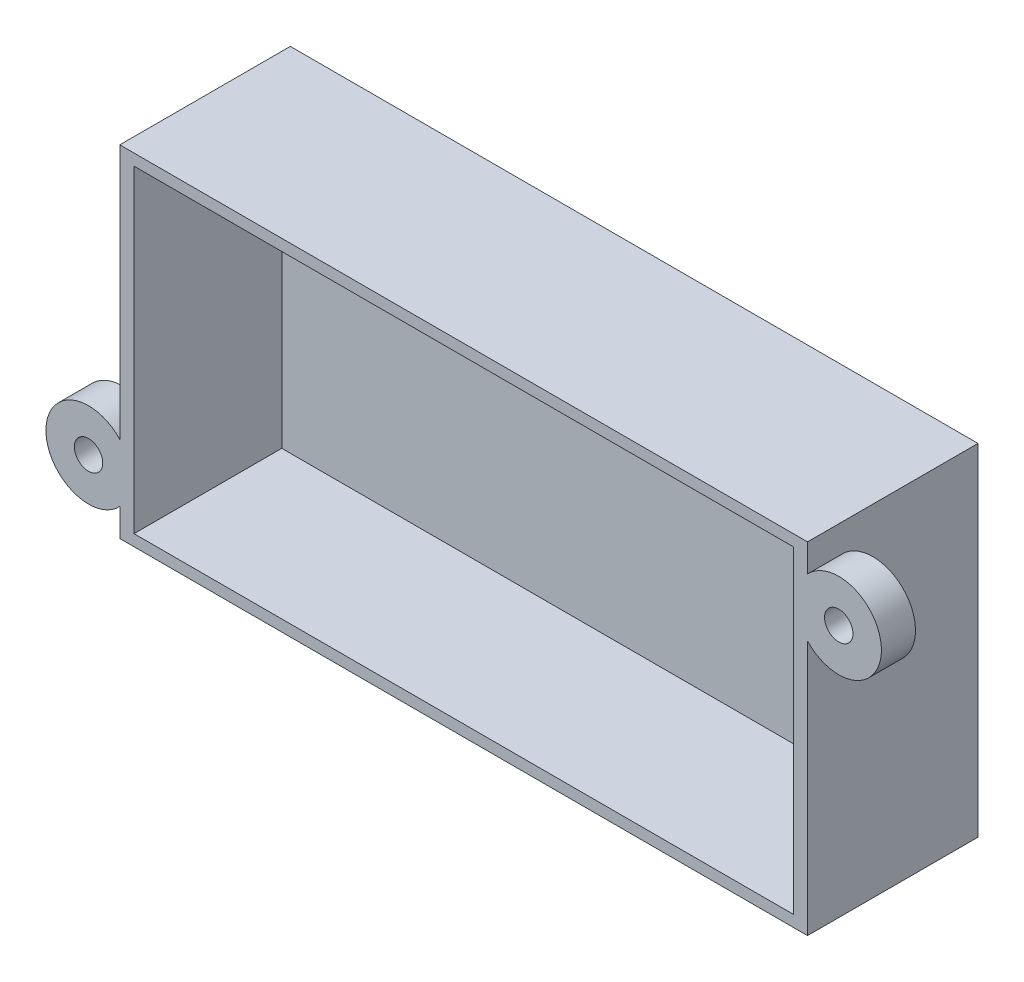
ISO-10303-21;
HEADER;
FILE_DESCRIPTION(('STEP AP214'),'2;1');
FILE_NAME('part.step','',(''),(''),'','','');
FILE_SCHEMA(('AUTOMOTIVE_DESIGN { 1 0 10303 214 1 1 1 1 }'));
ENDSEC;
DATA;
#1=APPLICATION_CONTEXT('core data for automotive mechanical design processes');
#2=APPLICATION_PROTOCOL_DEFINITION('international standard','automotive_design',2000,#1);
#3=PRODUCT_CONTEXT('',#1,'mechanical');
#4=PRODUCT('Part','Part','',(#3));
#5=PRODUCT_RELATED_PRODUCT_CATEGORY('part','',(#4));
#6=PRODUCT_DEFINITION_FORMATION('','',#4);
#7=PRODUCT_DEFINITION_CONTEXT('part definition',#1,'design');
#8=PRODUCT_DEFINITION('design','',#6,#7);
#9=PRODUCT_DEFINITION_SHAPE('','',#8);
#10=(LENGTH_UNIT() NAMED_UNIT(*) SI_UNIT(.MILLI.,.METRE.));
#11=(NAMED_UNIT(*) PLANE_ANGLE_UNIT() SI_UNIT($,.RADIAN.));
#12=(NAMED_UNIT(*) SI_UNIT($,.STERADIAN.) SOLID_ANGLE_UNIT());
#13=UNCERTAINTY_MEASURE_WITH_UNIT(LENGTH_MEASURE(1.E-05),#10,'distance_accuracy_value','');
#14=(GEOMETRIC_REPRESENTATION_CONTEXT(3) GLOBAL_UNCERTAINTY_ASSIGNED_CONTEXT((#13)) GLOBAL_UNIT_ASSIGNED_CONTEXT((#10,
#11,#12)) REPRESENTATION_CONTEXT('',''));
#15=CARTESIAN_POINT('',(0.,0.,0.));
#16=DIRECTION('',(0.,0.,1.));
#17=DIRECTION('',(1.,0.,0.));
#18=AXIS2_PLACEMENT_3D('',#15,#16,#17);
#19=CARTESIAN_POINT('',(30.25,15.,15.));
#20=DIRECTION('',(-1.,0.,0.));
#21=DIRECTION('',(0.,-1.,0.));
#22=AXIS2_PLACEMENT_3D('',#19,#20,#21);
#23=PLANE('',#22);
#24=DIRECTION('',(0.,0.,1.));
#25=VECTOR('',#24,1.);
#26=CARTESIAN_POINT('',(30.25,7.45049024320359,12.));
#27=LINE('',#26,#25);
#28=CARTESIAN_POINT('',(30.25,7.45049024320359,12.));
#29=VERTEX_POINT('',#28);
#30=CARTESIAN_POINT('',(30.25,7.45049024320359,15.));
#31=VERTEX_POINT('',#30);
#32=EDGE_CURVE('E162',#29,#31,#27,.T.);
#33=ORIENTED_EDGE('',*,*,#32,.T.);
#34=DIRECTION('',(0.,1.,0.));
#35=VECTOR('',#34,1.);
#36=CARTESIAN_POINT('',(30.25,15.,15.));
#37=LINE('',#36,#35);
#38=CARTESIAN_POINT('',(30.25,-15.,15.));
#39=VERTEX_POINT('',#38);
#40=EDGE_CURVE('E234',#39,#31,#37,.T.);
#41=ORIENTED_EDGE('',*,*,#40,.F.);
#42=DIRECTION('',(0.,0.,-1.));
#43=VECTOR('',#42,1.);
#44=CARTESIAN_POINT('',(30.25,-15.,15.));
#45=LINE('',#44,#43);
#46=CARTESIAN_POINT('',(30.25,-15.,0.));
#47=VERTEX_POINT('',#46);
#48=EDGE_CURVE('E248',#39,#47,#45,.T.);
#49=ORIENTED_EDGE('',*,*,#48,.T.);
#50=DIRECTION('',(0.,1.,0.));
#51=VECTOR('',#50,1.);
#52=CARTESIAN_POINT('',(30.25,15.,0.));
#53=LINE('',#52,#51);
#54=CARTESIAN_POINT('',(30.25,15.,0.));
#55=VERTEX_POINT('',#54);
#56=EDGE_CURVE('E224',#47,#55,#53,.T.);
#57=ORIENTED_EDGE('',*,*,#56,.T.);
#58=DIRECTION('',(0.,0.,-1.));
#59=VECTOR('',#58,1.);
#60=CARTESIAN_POINT('',(30.25,15.,15.));
#61=LINE('',#60,#59);
#62=CARTESIAN_POINT('',(30.25,15.,15.));
#63=VERTEX_POINT('',#62);
#64=EDGE_CURVE('E11',#63,#55,#61,.T.);
#65=ORIENTED_EDGE('',*,*,#64,.F.);
#66=CARTESIAN_POINT('',(30.25,12.5495097567964,15.));
#67=VERTEX_POINT('',#66);
#68=EDGE_CURVE('E238',#67,#63,#37,.T.);
#69=ORIENTED_EDGE('',*,*,#68,.F.);
#70=DIRECTION('',(0.,0.,1.));
#71=VECTOR('',#70,1.);
#72=CARTESIAN_POINT('',(30.25,12.5495097567964,12.));
#73=LINE('',#72,#71);
#74=CARTESIAN_POINT('',(30.25,12.5495097567964,12.));
#75=VERTEX_POINT('',#74);
#76=EDGE_CURVE('E179',#75,#67,#73,.T.);
#77=ORIENTED_EDGE('',*,*,#76,.F.);
#78=DIRECTION('',(0.,1.,0.));
#79=VECTOR('',#78,1.);
#80=CARTESIAN_POINT('',(30.25,0.,12.));
#81=LINE('',#80,#79);
#82=EDGE_CURVE('E171',#29,#75,#81,.T.);
#83=ORIENTED_EDGE('',*,*,#82,.F.);
#84=EDGE_LOOP('',(#33,#41,#49,#57,#65,#69,#77,#83));
#85=FACE_BOUND('',#84,.T.);
#86=ADVANCED_FACE('F45',(#85),#23,.F.);
#87=CARTESIAN_POINT('',(-30.25,15.,15.));
#88=DIRECTION('',(0.,-1.,0.));
#89=DIRECTION('',(0.,0.,-1.));
#90=AXIS2_PLACEMENT_3D('',#87,#88,#89);
#91=PLANE('',#90);
#92=DIRECTION('',(-1.,0.,0.));
#93=VECTOR('',#92,1.);
#94=CARTESIAN_POINT('',(-30.25,15.,0.));
#95=LINE('',#94,#93);
#96=CARTESIAN_POINT('',(-30.25,15.,0.));
#97=VERTEX_POINT('',#96);
#98=EDGE_CURVE('E252',#55,#97,#95,.T.);
#99=ORIENTED_EDGE('',*,*,#98,.T.);
#100=DIRECTION('',(0.,0.,-1.));
#101=VECTOR('',#100,1.);
#102=CARTESIAN_POINT('',(-30.25,15.,15.));
#103=LINE('',#102,#101);
#104=CARTESIAN_POINT('',(-30.25,15.,15.));
#105=VERTEX_POINT('',#104);
#106=EDGE_CURVE('E53',#105,#97,#103,.T.);
#107=ORIENTED_EDGE('',*,*,#106,.F.);
#108=DIRECTION('',(-1.,0.,0.));
#109=VECTOR('',#108,1.);
#110=CARTESIAN_POINT('',(-30.25,15.,15.));
#111=LINE('',#110,#109);
#112=EDGE_CURVE('E237',#63,#105,#111,.T.);
#113=ORIENTED_EDGE('',*,*,#112,.F.);
#114=ORIENTED_EDGE('',*,*,#64,.T.);
#115=EDGE_LOOP('',(#99,#107,#113,#114));
#116=FACE_BOUND('',#115,.T.);
#117=ADVANCED_FACE('F293',(#116),#91,.F.);
#118=CARTESIAN_POINT('',(-30.25,15.,15.));
#119=DIRECTION('',(1.,0.,0.));
#120=DIRECTION('',(0.,1.,0.));
#121=AXIS2_PLACEMENT_3D('',#118,#119,#120);
#122=PLANE('',#121);
#123=DIRECTION('',(0.,-1.,0.));
#124=VECTOR('',#123,1.);
#125=CARTESIAN_POINT('',(-30.25,0.,12.));
#126=LINE('',#125,#124);
#127=CARTESIAN_POINT('',(-30.25,-7.4504902432036,12.));
#128=VERTEX_POINT('',#127);
#129=CARTESIAN_POINT('',(-30.25,-12.5495097567964,12.));
#130=VERTEX_POINT('',#129);
#131=EDGE_CURVE('E146',#128,#130,#126,.T.);
#132=ORIENTED_EDGE('',*,*,#131,.F.);
#133=DIRECTION('',(0.,0.,1.));
#134=VECTOR('',#133,1.);
#135=CARTESIAN_POINT('',(-30.25,-7.4504902432036,12.));
#136=LINE('',#135,#134);
#137=CARTESIAN_POINT('',(-30.25,-7.4504902432036,15.));
#138=VERTEX_POINT('',#137);
#139=EDGE_CURVE('E133',#128,#138,#136,.T.);
#140=ORIENTED_EDGE('',*,*,#139,.T.);
#141=DIRECTION('',(0.,-1.,0.));
#142=VECTOR('',#141,1.);
#143=CARTESIAN_POINT('',(-30.25,15.,15.));
#144=LINE('',#143,#142);
#145=EDGE_CURVE('E242',#105,#138,#144,.T.);
#146=ORIENTED_EDGE('',*,*,#145,.F.);
#147=ORIENTED_EDGE('',*,*,#106,.T.);
#148=DIRECTION('',(0.,-1.,0.));
#149=VECTOR('',#148,1.);
#150=CARTESIAN_POINT('',(-30.25,15.,0.));
#151=LINE('',#150,#149);
#152=CARTESIAN_POINT('',(-30.25,-15.,0.));
#153=VERTEX_POINT('',#152);
#154=EDGE_CURVE('E255',#97,#153,#151,.T.);
#155=ORIENTED_EDGE('',*,*,#154,.T.);
#156=DIRECTION('',(0.,0.,-1.));
#157=VECTOR('',#156,1.);
#158=CARTESIAN_POINT('',(-30.25,-15.,15.));
#159=LINE('',#158,#157);
#160=CARTESIAN_POINT('',(-30.25,-15.,15.));
#161=VERTEX_POINT('',#160);
#162=EDGE_CURVE('E264',#161,#153,#159,.T.);
#163=ORIENTED_EDGE('',*,*,#162,.F.);
#164=CARTESIAN_POINT('',(-30.25,-12.5495097567964,15.));
#165=VERTEX_POINT('',#164);
#166=EDGE_CURVE('E241',#165,#161,#144,.T.);
#167=ORIENTED_EDGE('',*,*,#166,.F.);
#168=DIRECTION('',(0.,0.,1.));
#169=VECTOR('',#168,1.);
#170=CARTESIAN_POINT('',(-30.25,-12.5495097567964,12.));
#171=LINE('',#170,#169);
#172=EDGE_CURVE('E142',#130,#165,#171,.T.);
#173=ORIENTED_EDGE('',*,*,#172,.F.);
#174=EDGE_LOOP('',(#132,#140,#146,#147,#155,#163,#167,#173));
#175=FACE_BOUND('',#174,.T.);
#176=ADVANCED_FACE('F149',(#175),#122,.F.);
#177=CARTESIAN_POINT('',(-30.25,-15.,15.));
#178=DIRECTION('',(0.,1.,0.));
#179=DIRECTION('',(0.,0.,1.));
#180=AXIS2_PLACEMENT_3D('',#177,#178,#179);
#181=PLANE('',#180);
#182=DIRECTION('',(1.,0.,0.));
#183=VECTOR('',#182,1.);
#184=CARTESIAN_POINT('',(-30.25,-15.,0.));
#185=LINE('',#184,#183);
#186=EDGE_CURVE('E258',#153,#47,#185,.T.);
#187=ORIENTED_EDGE('',*,*,#186,.T.);
#188=ORIENTED_EDGE('',*,*,#48,.F.);
#189=DIRECTION('',(1.,0.,0.));
#190=VECTOR('',#189,1.);
#191=CARTESIAN_POINT('',(-30.25,-15.,15.));
#192=LINE('',#191,#190);
#193=EDGE_CURVE('E245',#161,#39,#192,.T.);
#194=ORIENTED_EDGE('',*,*,#193,.F.);
#195=ORIENTED_EDGE('',*,*,#162,.T.);
#196=EDGE_LOOP('',(#187,#188,#194,#195));
#197=FACE_BOUND('',#196,.T.);
#198=ADVANCED_FACE('F280',(#197),#181,.F.);
#199=CARTESIAN_POINT('',(0.,0.,15.));
#200=DIRECTION('',(0.,0.,1.));
#201=DIRECTION('',(1.,0.,0.));
#202=AXIS2_PLACEMENT_3D('',#199,#200,#201);
#203=PLANE('',#202);
#204=DIRECTION('',(0.,1.,0.));
#205=VECTOR('',#204,1.);
#206=CARTESIAN_POINT('',(29.,-14.,15.));
#207=LINE('',#206,#205);
#208=CARTESIAN_POINT('',(29.,-14.,15.));
#209=VERTEX_POINT('',#208);
#210=CARTESIAN_POINT('',(29.,14.,15.));
#211=VERTEX_POINT('',#210);
#212=EDGE_CURVE('E166',#209,#211,#207,.T.);
#213=ORIENTED_EDGE('',*,*,#212,.F.);
#214=DIRECTION('',(1.,0.,0.));
#215=VECTOR('',#214,1.);
#216=CARTESIAN_POINT('',(-29.,-14.,15.));
#217=LINE('',#216,#215);
#218=CARTESIAN_POINT('',(-29.,-14.,15.));
#219=VERTEX_POINT('',#218);
#220=EDGE_CURVE('E195',#219,#209,#217,.T.);
#221=ORIENTED_EDGE('',*,*,#220,.F.);
#222=DIRECTION('',(0.,-1.,0.));
#223=VECTOR('',#222,1.);
#224=CARTESIAN_POINT('',(-29.,-14.,15.));
#225=LINE('',#224,#223);
#226=CARTESIAN_POINT('',(-29.,14.,15.));
#227=VERTEX_POINT('',#226);
#228=EDGE_CURVE('E214',#227,#219,#225,.T.);
#229=ORIENTED_EDGE('',*,*,#228,.F.);
#230=DIRECTION('',(-1.,0.,0.));
#231=VECTOR('',#230,1.);
#232=CARTESIAN_POINT('',(-29.,14.,15.));
#233=LINE('',#232,#231);
#234=EDGE_CURVE('E210',#211,#227,#233,.T.);
#235=ORIENTED_EDGE('',*,*,#234,.F.);
#236=EDGE_LOOP('',(#213,#221,#229,#235));
#237=FACE_BOUND('',#236,.T.);
#238=ORIENTED_EDGE('',*,*,#40,.T.);
#239=CARTESIAN_POINT('',(33.,9.99999999999999,15.));
#240=DIRECTION('',(0.,0.,1.));
#241=DIRECTION('',(1.,0.,0.));
#242=AXIS2_PLACEMENT_3D('',#239,#240,#241);
#243=CIRCLE('',#242,3.74999999999998);
#244=EDGE_CURVE('E67',#67,#31,#243,.F.);
#245=ORIENTED_EDGE('',*,*,#244,.F.);
#246=ORIENTED_EDGE('',*,*,#68,.T.);
#247=ORIENTED_EDGE('',*,*,#112,.T.);
#248=ORIENTED_EDGE('',*,*,#145,.T.);
#249=CARTESIAN_POINT('',(-33.,-10.,15.));
#250=DIRECTION('',(0.,0.,1.));
#251=DIRECTION('',(1.,0.,0.));
#252=AXIS2_PLACEMENT_3D('',#249,#250,#251);
#253=CIRCLE('',#252,3.75);
#254=EDGE_CURVE('E60',#138,#165,#253,.T.);
#255=ORIENTED_EDGE('',*,*,#254,.T.);
#256=ORIENTED_EDGE('',*,*,#166,.T.);
#257=ORIENTED_EDGE('',*,*,#193,.T.);
#258=EDGE_LOOP('',(#238,#245,#246,#247,#248,#255,#256,#257));
#259=FACE_BOUND('',#258,.T.);
#260=CARTESIAN_POINT('',(33.,9.99999999999999,15.));
#261=DIRECTION('',(0.,0.,1.));
#262=DIRECTION('',(1.,0.,0.));
#263=AXIS2_PLACEMENT_3D('',#260,#261,#262);
#264=CIRCLE('',#263,1.25000000000001);
#265=CARTESIAN_POINT('',(34.25,9.99999999999999,15.));
#266=VERTEX_POINT('',#265);
#267=EDGE_CURVE('E172',#266,#266,#264,.F.);
#268=ORIENTED_EDGE('',*,*,#267,.T.);
#269=EDGE_LOOP('',(#268));
#270=FACE_BOUND('',#269,.T.);
#271=CARTESIAN_POINT('',(-33.,-10.,15.));
#272=DIRECTION('',(0.,0.,1.));
#273=DIRECTION('',(1.,0.,0.));
#274=AXIS2_PLACEMENT_3D('',#271,#272,#273);
#275=CIRCLE('',#274,1.25);
#276=CARTESIAN_POINT('',(-31.75,-10.,15.));
#277=VERTEX_POINT('',#276);
#278=EDGE_CURVE('E158',#277,#277,#275,.T.);
#279=ORIENTED_EDGE('',*,*,#278,.F.);
#280=EDGE_LOOP('',(#279));
#281=FACE_BOUND('',#280,.T.);
#282=ADVANCED_FACE('F287',(#237,#259,#270,#281),#203,.T.);
#283=CARTESIAN_POINT('',(0.,0.,0.));
#284=DIRECTION('',(0.,0.,1.));
#285=DIRECTION('',(1.,0.,0.));
#286=AXIS2_PLACEMENT_3D('',#283,#284,#285);
#287=PLANE('',#286);
#288=ORIENTED_EDGE('',*,*,#56,.F.);
#289=ORIENTED_EDGE('',*,*,#186,.F.);
#290=ORIENTED_EDGE('',*,*,#154,.F.);
#291=ORIENTED_EDGE('',*,*,#98,.F.);
#292=EDGE_LOOP('',(#288,#289,#290,#291));
#293=FACE_BOUND('',#292,.T.);
#294=ADVANCED_FACE('F277',(#293),#287,.F.);
#295=CARTESIAN_POINT('',(29.,-14.,2.));
#296=DIRECTION('',(1.,0.,0.));
#297=DIRECTION('',(0.,0.,-1.));
#298=AXIS2_PLACEMENT_3D('',#295,#296,#297);
#299=PLANE('',#298);
#300=ORIENTED_EDGE('',*,*,#212,.T.);
#301=DIRECTION('',(0.,0.,1.));
#302=VECTOR('',#301,1.);
#303=CARTESIAN_POINT('',(29.,14.,2.));
#304=LINE('',#303,#302);
#305=CARTESIAN_POINT('',(29.,14.,2.));
#306=VERTEX_POINT('',#305);
#307=EDGE_CURVE('E207',#306,#211,#304,.T.);
#308=ORIENTED_EDGE('',*,*,#307,.F.);
#309=DIRECTION('',(0.,1.,0.));
#310=VECTOR('',#309,1.);
#311=CARTESIAN_POINT('',(29.,-14.,2.));
#312=LINE('',#311,#310);
#313=CARTESIAN_POINT('',(29.,-14.,2.));
#314=VERTEX_POINT('',#313);
#315=EDGE_CURVE('E190',#314,#306,#312,.T.);
#316=ORIENTED_EDGE('',*,*,#315,.F.);
#317=DIRECTION('',(0.,0.,1.));
#318=VECTOR('',#317,1.);
#319=CARTESIAN_POINT('',(29.,-14.,2.));
#320=LINE('',#319,#318);
#321=EDGE_CURVE('E221',#314,#209,#320,.T.);
#322=ORIENTED_EDGE('',*,*,#321,.T.);
#323=EDGE_LOOP('',(#300,#308,#316,#322));
#324=FACE_BOUND('',#323,.T.);
#325=ADVANCED_FACE('F305',(#324),#299,.F.);
#326=CARTESIAN_POINT('',(-29.,-14.,2.));
#327=DIRECTION('',(0.,-1.,0.));
#328=DIRECTION('',(0.,0.,-1.));
#329=AXIS2_PLACEMENT_3D('',#326,#327,#328);
#330=PLANE('',#329);
#331=ORIENTED_EDGE('',*,*,#220,.T.);
#332=ORIENTED_EDGE('',*,*,#321,.F.);
#333=DIRECTION('',(1.,0.,0.));
#334=VECTOR('',#333,1.);
#335=CARTESIAN_POINT('',(-29.,-14.,2.));
#336=LINE('',#335,#334);
#337=CARTESIAN_POINT('',(-29.,-14.,2.));
#338=VERTEX_POINT('',#337);
#339=EDGE_CURVE('E203',#338,#314,#336,.T.);
#340=ORIENTED_EDGE('',*,*,#339,.F.);
#341=DIRECTION('',(0.,0.,1.));
#342=VECTOR('',#341,1.);
#343=CARTESIAN_POINT('',(-29.,-14.,2.));
#344=LINE('',#343,#342);
#345=EDGE_CURVE('E225',#338,#219,#344,.T.);
#346=ORIENTED_EDGE('',*,*,#345,.T.);
#347=EDGE_LOOP('',(#331,#332,#340,#346));
#348=FACE_BOUND('',#347,.T.);
#349=ADVANCED_FACE('F311',(#348),#330,.F.);
#350=CARTESIAN_POINT('',(-29.,-14.,2.));
#351=DIRECTION('',(-1.,0.,0.));
#352=DIRECTION('',(0.,0.,1.));
#353=AXIS2_PLACEMENT_3D('',#350,#351,#352);
#354=PLANE('',#353);
#355=ORIENTED_EDGE('',*,*,#228,.T.);
#356=ORIENTED_EDGE('',*,*,#345,.F.);
#357=DIRECTION('',(0.,-1.,0.));
#358=VECTOR('',#357,1.);
#359=CARTESIAN_POINT('',(-29.,-14.,2.));
#360=LINE('',#359,#358);
#361=CARTESIAN_POINT('',(-29.,14.,2.));
#362=VERTEX_POINT('',#361);
#363=EDGE_CURVE('E199',#362,#338,#360,.T.);
#364=ORIENTED_EDGE('',*,*,#363,.F.);
#365=DIRECTION('',(0.,0.,1.));
#366=VECTOR('',#365,1.);
#367=CARTESIAN_POINT('',(-29.,14.,2.));
#368=LINE('',#367,#366);
#369=EDGE_CURVE('E228',#362,#227,#368,.T.);
#370=ORIENTED_EDGE('',*,*,#369,.T.);
#371=EDGE_LOOP('',(#355,#356,#364,#370));
#372=FACE_BOUND('',#371,.T.);
#373=ADVANCED_FACE('F317',(#372),#354,.F.);
#374=CARTESIAN_POINT('',(-29.,14.,2.));
#375=DIRECTION('',(0.,1.,0.));
#376=DIRECTION('',(0.,0.,1.));
#377=AXIS2_PLACEMENT_3D('',#374,#375,#376);
#378=PLANE('',#377);
#379=ORIENTED_EDGE('',*,*,#234,.T.);
#380=ORIENTED_EDGE('',*,*,#369,.F.);
#381=DIRECTION('',(-1.,0.,0.));
#382=VECTOR('',#381,1.);
#383=CARTESIAN_POINT('',(-29.,14.,2.));
#384=LINE('',#383,#382);
#385=EDGE_CURVE('E194',#306,#362,#384,.T.);
#386=ORIENTED_EDGE('',*,*,#385,.F.);
#387=ORIENTED_EDGE('',*,*,#307,.T.);
#388=EDGE_LOOP('',(#379,#380,#386,#387));
#389=FACE_BOUND('',#388,.T.);
#390=ADVANCED_FACE('F313',(#389),#378,.F.);
#391=CARTESIAN_POINT('',(0.,0.,2.));
#392=DIRECTION('',(0.,0.,-1.));
#393=DIRECTION('',(-1.,0.,0.));
#394=AXIS2_PLACEMENT_3D('',#391,#392,#393);
#395=PLANE('',#394);
#396=ORIENTED_EDGE('',*,*,#315,.T.);
#397=ORIENTED_EDGE('',*,*,#385,.T.);
#398=ORIENTED_EDGE('',*,*,#363,.T.);
#399=ORIENTED_EDGE('',*,*,#339,.T.);
#400=EDGE_LOOP('',(#396,#397,#398,#399));
#401=FACE_BOUND('',#400,.T.);
#402=ADVANCED_FACE('F316',(#401),#395,.F.);
#403=CARTESIAN_POINT('',(33.,9.99999999999999,12.));
#404=DIRECTION('',(0.,0.,1.));
#405=DIRECTION('',(1.,0.,0.));
#406=AXIS2_PLACEMENT_3D('',#403,#404,#405);
#407=CYLINDRICAL_SURFACE('',#406,3.74999999999998);
#408=ORIENTED_EDGE('',*,*,#244,.T.);
#409=ORIENTED_EDGE('',*,*,#32,.F.);
#410=CARTESIAN_POINT('',(33.,9.99999999999999,12.));
#411=DIRECTION('',(0.,0.,1.));
#412=DIRECTION('',(1.,0.,0.));
#413=AXIS2_PLACEMENT_3D('',#410,#411,#412);
#414=CIRCLE('',#413,3.74999999999998);
#415=EDGE_CURVE('E168',#75,#29,#414,.F.);
#416=ORIENTED_EDGE('',*,*,#415,.F.);
#417=ORIENTED_EDGE('',*,*,#76,.T.);
#418=EDGE_LOOP('',(#408,#409,#416,#417));
#419=FACE_BOUND('',#418,.T.);
#420=ADVANCED_FACE('F327',(#419),#407,.T.);
#421=CARTESIAN_POINT('',(33.,9.99999999999999,12.));
#422=DIRECTION('',(0.,0.,1.));
#423=DIRECTION('',(1.,0.,0.));
#424=AXIS2_PLACEMENT_3D('',#421,#422,#423);
#425=CYLINDRICAL_SURFACE('',#424,1.25000000000001);
#426=CARTESIAN_POINT('',(33.,9.99999999999999,12.));
#427=DIRECTION('',(0.,0.,1.));
#428=DIRECTION('',(1.,0.,0.));
#429=AXIS2_PLACEMENT_3D('',#426,#427,#428);
#430=CIRCLE('',#429,1.25000000000001);
#431=CARTESIAN_POINT('',(34.25,9.99999999999999,12.));
#432=VERTEX_POINT('',#431);
#433=EDGE_CURVE('E175',#432,#432,#430,.F.);
#434=ORIENTED_EDGE('',*,*,#433,.T.);
#435=EDGE_LOOP('',(#434));
#436=FACE_BOUND('',#435,.T.);
#437=ORIENTED_EDGE('',*,*,#267,.F.);
#438=EDGE_LOOP('',(#437));
#439=FACE_BOUND('',#438,.T.);
#440=ADVANCED_FACE('F331',(#436,#439),#425,.F.);
#441=CARTESIAN_POINT('',(0.,0.,12.));
#442=DIRECTION('',(0.,0.,1.));
#443=DIRECTION('',(1.,0.,0.));
#444=AXIS2_PLACEMENT_3D('',#441,#442,#443);
#445=PLANE('',#444);
#446=ORIENTED_EDGE('',*,*,#415,.T.);
#447=ORIENTED_EDGE('',*,*,#82,.T.);
#448=EDGE_LOOP('',(#446,#447));
#449=FACE_BOUND('',#448,.T.);
#450=ORIENTED_EDGE('',*,*,#433,.F.);
#451=EDGE_LOOP('',(#450));
#452=FACE_BOUND('',#451,.T.);
#453=ADVANCED_FACE('F335',(#449,#452),#445,.F.);
#454=CARTESIAN_POINT('',(-33.,-10.,12.));
#455=DIRECTION('',(0.,0.,1.));
#456=DIRECTION('',(1.,0.,0.));
#457=AXIS2_PLACEMENT_3D('',#454,#455,#456);
#458=CYLINDRICAL_SURFACE('',#457,1.25);
#459=CARTESIAN_POINT('',(-33.,-10.,12.));
#460=DIRECTION('',(0.,0.,1.));
#461=DIRECTION('',(1.,0.,0.));
#462=AXIS2_PLACEMENT_3D('',#459,#460,#461);
#463=CIRCLE('',#462,1.25);
#464=CARTESIAN_POINT('',(-31.75,-10.,12.));
#465=VERTEX_POINT('',#464);
#466=EDGE_CURVE('E152',#465,#465,#463,.T.);
#467=ORIENTED_EDGE('',*,*,#466,.F.);
#468=EDGE_LOOP('',(#467));
#469=FACE_BOUND('',#468,.T.);
#470=ORIENTED_EDGE('',*,*,#278,.T.);
#471=EDGE_LOOP('',(#470));
#472=FACE_BOUND('',#471,.T.);
#473=ADVANCED_FACE('F339',(#469,#472),#458,.F.);
#474=CARTESIAN_POINT('',(-33.,-10.,12.));
#475=DIRECTION('',(0.,0.,1.));
#476=DIRECTION('',(1.,0.,0.));
#477=AXIS2_PLACEMENT_3D('',#474,#475,#476);
#478=CYLINDRICAL_SURFACE('',#477,3.75);
#479=ORIENTED_EDGE('',*,*,#254,.F.);
#480=ORIENTED_EDGE('',*,*,#139,.F.);
#481=CARTESIAN_POINT('',(-33.,-10.,12.));
#482=DIRECTION('',(0.,0.,1.));
#483=DIRECTION('',(1.,0.,0.));
#484=AXIS2_PLACEMENT_3D('',#481,#482,#483);
#485=CIRCLE('',#484,3.75);
#486=EDGE_CURVE('E136',#128,#130,#485,.T.);
#487=ORIENTED_EDGE('',*,*,#486,.T.);
#488=ORIENTED_EDGE('',*,*,#172,.T.);
#489=EDGE_LOOP('',(#479,#480,#487,#488));
#490=FACE_BOUND('',#489,.T.);
#491=ADVANCED_FACE('F135',(#490),#478,.T.);
#492=CARTESIAN_POINT('',(0.,0.,12.));
#493=DIRECTION('',(0.,0.,1.));
#494=DIRECTION('',(1.,0.,0.));
#495=AXIS2_PLACEMENT_3D('',#492,#493,#494);
#496=PLANE('',#495);
#497=ORIENTED_EDGE('',*,*,#466,.T.);
#498=EDGE_LOOP('',(#497));
#499=FACE_BOUND('',#498,.T.);
#500=ORIENTED_EDGE('',*,*,#131,.T.);
#501=ORIENTED_EDGE('',*,*,#486,.F.);
#502=EDGE_LOOP('',(#500,#501));
#503=FACE_BOUND('',#502,.T.);
#504=ADVANCED_FACE('F145',(#499,#503),#496,.F.);
#505=CLOSED_SHELL('',(#86,#117,#176,#198,#282,#294,#325,#349,#373,#390,#402,#420,#440,#453,#473,
#491,#504));
#506=MANIFOLD_SOLID_BREP('B2',#505);
#507=ADVANCED_BREP_SHAPE_REPRESENTATION('',(#18,#506),#14);
#508=SHAPE_DEFINITION_REPRESENTATION(#9,#507);
ENDSEC;
END-ISO-10303-21;
